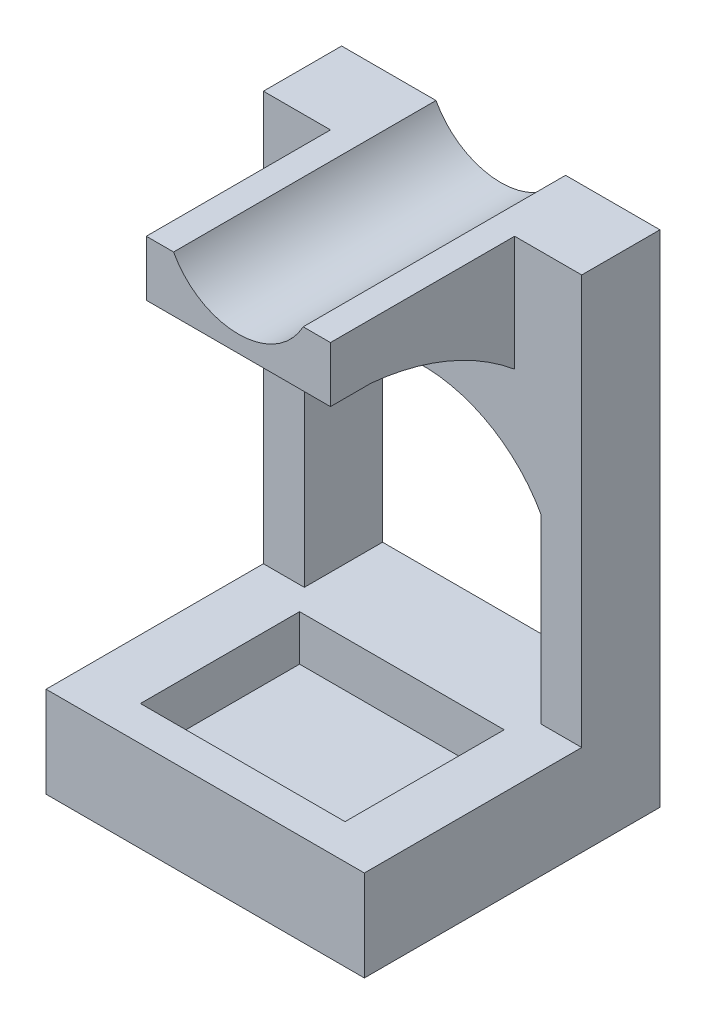
ISO-10303-21;
HEADER;
FILE_DESCRIPTION(('STEP AP214'),'2;1');
FILE_NAME('part.step','',(''),(''),'','','');
FILE_SCHEMA(('AUTOMOTIVE_DESIGN { 1 0 10303 214 1 1 1 1 }'));
ENDSEC;
DATA;
#1=APPLICATION_CONTEXT('core data for automotive mechanical design processes');
#2=APPLICATION_PROTOCOL_DEFINITION('international standard','automotive_design',2000,#1);
#3=PRODUCT_CONTEXT('',#1,'mechanical');
#4=PRODUCT('Part','Part','',(#3));
#5=PRODUCT_RELATED_PRODUCT_CATEGORY('part','',(#4));
#6=PRODUCT_DEFINITION_FORMATION('','',#4);
#7=PRODUCT_DEFINITION_CONTEXT('part definition',#1,'design');
#8=PRODUCT_DEFINITION('design','',#6,#7);
#9=PRODUCT_DEFINITION_SHAPE('','',#8);
#10=(LENGTH_UNIT() NAMED_UNIT(*) SI_UNIT(.MILLI.,.METRE.));
#11=(NAMED_UNIT(*) PLANE_ANGLE_UNIT() SI_UNIT($,.RADIAN.));
#12=(NAMED_UNIT(*) SI_UNIT($,.STERADIAN.) SOLID_ANGLE_UNIT());
#13=UNCERTAINTY_MEASURE_WITH_UNIT(LENGTH_MEASURE(1.E-05),#10,'distance_accuracy_value','');
#14=(GEOMETRIC_REPRESENTATION_CONTEXT(3) GLOBAL_UNCERTAINTY_ASSIGNED_CONTEXT((#13)) GLOBAL_UNIT_ASSIGNED_CONTEXT((#10,
#11,#12)) REPRESENTATION_CONTEXT('',''));
#15=CARTESIAN_POINT('',(0.,0.,0.));
#16=DIRECTION('',(0.,0.,1.));
#17=DIRECTION('',(1.,0.,0.));
#18=AXIS2_PLACEMENT_3D('',#15,#16,#17);
#19=CARTESIAN_POINT('',(0.,95.,-47.7945006776525));
#20=DIRECTION('',(0.,0.,-1.));
#21=DIRECTION('',(-1.,0.,0.));
#22=AXIS2_PLACEMENT_3D('',#19,#20,#21);
#23=PLANE('',#22);
#24=DIRECTION('',(0.,1.,0.));
#25=VECTOR('',#24,1.);
#26=CARTESIAN_POINT('',(55.25,110.,-47.7945006776525));
#27=LINE('',#26,#25);
#28=CARTESIAN_POINT('',(55.25,84.6757577504854,-47.7945006776525));
#29=VERTEX_POINT('',#28);
#30=CARTESIAN_POINT('',(55.25,110.,-47.7945006776525));
#31=VERTEX_POINT('',#30);
#32=EDGE_CURVE('E492',#29,#31,#27,.T.);
#33=ORIENTED_EDGE('',*,*,#32,.F.);
#34=DIRECTION('',(-1.,0.,0.));
#35=VECTOR('',#34,1.);
#36=CARTESIAN_POINT('',(55.25,84.6757577504854,-47.7945006776525));
#37=LINE('',#36,#35);
#38=CARTESIAN_POINT('',(14.75,84.6757577504854,-47.7945006776525));
#39=VERTEX_POINT('',#38);
#40=EDGE_CURVE('E219',#29,#39,#37,.T.);
#41=ORIENTED_EDGE('',*,*,#40,.T.);
#42=DIRECTION('',(0.,-1.,0.));
#43=VECTOR('',#42,1.);
#44=CARTESIAN_POINT('',(14.75,110.,-47.7945006776525));
#45=LINE('',#44,#43);
#46=CARTESIAN_POINT('',(14.75,110.,-47.7945006776525));
#47=VERTEX_POINT('',#46);
#48=EDGE_CURVE('E489',#47,#39,#45,.T.);
#49=ORIENTED_EDGE('',*,*,#48,.F.);
#50=DIRECTION('',(1.,0.,0.));
#51=VECTOR('',#50,1.);
#52=CARTESIAN_POINT('',(0.,110.,-47.7945006776525));
#53=LINE('',#52,#51);
#54=CARTESIAN_POINT('',(0.,110.,-47.7945006776525));
#55=VERTEX_POINT('',#54);
#56=EDGE_CURVE('E266',#55,#47,#53,.T.);
#57=ORIENTED_EDGE('',*,*,#56,.F.);
#58=DIRECTION('',(0.,-1.,0.));
#59=VECTOR('',#58,1.);
#60=CARTESIAN_POINT('',(0.,95.,-47.7945006776525));
#61=LINE('',#60,#59);
#62=CARTESIAN_POINT('',(0.,20.,-47.7945006776525));
#63=VERTEX_POINT('',#62);
#64=EDGE_CURVE('E370',#55,#63,#61,.T.);
#65=ORIENTED_EDGE('',*,*,#64,.T.);
#66=DIRECTION('',(1.,0.,0.));
#67=VECTOR('',#66,1.);
#68=CARTESIAN_POINT('',(0.,20.,-47.7945006776525));
#69=LINE('',#68,#67);
#70=CARTESIAN_POINT('',(8.99999999999998,20.,-47.7945006776525));
#71=VERTEX_POINT('',#70);
#72=EDGE_CURVE('E362',#63,#71,#69,.T.);
#73=ORIENTED_EDGE('',*,*,#72,.T.);
#74=DIRECTION('',(0.,-1.,0.));
#75=VECTOR('',#74,1.);
#76=CARTESIAN_POINT('',(8.99999999999999,60.,-47.7945006776525));
#77=LINE('',#76,#75);
#78=CARTESIAN_POINT('',(8.99999999999999,60.,-47.7945006776525));
#79=VERTEX_POINT('',#78);
#80=EDGE_CURVE('E323',#79,#71,#77,.T.);
#81=ORIENTED_EDGE('',*,*,#80,.F.);
#82=CARTESIAN_POINT('',(35.,45.5175775828065,-47.7945006776525));
#83=DIRECTION('',(0.,0.,-1.));
#84=DIRECTION('',(-1.,0.,0.));
#85=AXIS2_PLACEMENT_3D('',#82,#83,#84);
#86=CIRCLE('',#85,29.7613937689422);
#87=CARTESIAN_POINT('',(61.,60.,-47.7945006776525));
#88=VERTEX_POINT('',#87);
#89=EDGE_CURVE('E319',#88,#79,#86,.F.);
#90=ORIENTED_EDGE('',*,*,#89,.F.);
#91=DIRECTION('',(0.,1.,0.));
#92=VECTOR('',#91,1.);
#93=CARTESIAN_POINT('',(61.,60.,-47.7945006776525));
#94=LINE('',#93,#92);
#95=CARTESIAN_POINT('',(61.,20.,-47.7945006776525));
#96=VERTEX_POINT('',#95);
#97=EDGE_CURVE('E348',#96,#88,#94,.T.);
#98=ORIENTED_EDGE('',*,*,#97,.F.);
#99=CARTESIAN_POINT('',(70.,20.,-47.7945006776525));
#100=VERTEX_POINT('',#99);
#101=EDGE_CURVE('E361',#96,#100,#69,.T.);
#102=ORIENTED_EDGE('',*,*,#101,.T.);
#103=DIRECTION('',(0.,-1.,0.));
#104=VECTOR('',#103,1.);
#105=CARTESIAN_POINT('',(70.,95.,-47.7945006776525));
#106=LINE('',#105,#104);
#107=CARTESIAN_POINT('',(70.,110.,-47.7945006776525));
#108=VERTEX_POINT('',#107);
#109=EDGE_CURVE('E366',#108,#100,#106,.T.);
#110=ORIENTED_EDGE('',*,*,#109,.F.);
#111=EDGE_CURVE('E265',#31,#108,#53,.T.);
#112=ORIENTED_EDGE('',*,*,#111,.F.);
#113=EDGE_LOOP('',(#33,#41,#49,#57,#65,#73,#81,#90,#98,#102,#110,#112));
#114=FACE_BOUND('',#113,.T.);
#115=ADVANCED_FACE('F43',(#114),#23,.F.);
#116=CARTESIAN_POINT('',(0.,110.,0.));
#117=DIRECTION('',(0.,1.,0.));
#118=DIRECTION('',(0.,0.,1.));
#119=AXIS2_PLACEMENT_3D('',#116,#117,#118);
#120=PLANE('',#119);
#121=DIRECTION('',(-1.,0.,0.));
#122=VECTOR('',#121,1.);
#123=CARTESIAN_POINT('',(0.,110.,-65.));
#124=LINE('',#123,#122);
#125=CARTESIAN_POINT('',(70.,110.,-65.));
#126=VERTEX_POINT('',#125);
#127=CARTESIAN_POINT('',(49.25,110.,-65.));
#128=VERTEX_POINT('',#127);
#129=EDGE_CURVE('E275',#126,#128,#124,.T.);
#130=ORIENTED_EDGE('',*,*,#129,.T.);
#131=DIRECTION('',(0.,0.,1.));
#132=VECTOR('',#131,1.);
#133=CARTESIAN_POINT('',(49.25,110.,-268.616902707103));
#134=LINE('',#133,#132);
#135=CARTESIAN_POINT('',(49.25,110.,-7.29450067765245));
#136=VERTEX_POINT('',#135);
#137=EDGE_CURVE('E253',#128,#136,#134,.T.);
#138=ORIENTED_EDGE('',*,*,#137,.T.);
#139=DIRECTION('',(-1.,0.,0.));
#140=VECTOR('',#139,1.);
#141=CARTESIAN_POINT('',(49.25,110.,-7.29450067765245));
#142=LINE('',#141,#140);
#143=CARTESIAN_POINT('',(55.25,110.,-7.29450067765245));
#144=VERTEX_POINT('',#143);
#145=EDGE_CURVE('E247',#144,#136,#142,.T.);
#146=ORIENTED_EDGE('',*,*,#145,.F.);
#147=DIRECTION('',(0.,0.,-1.));
#148=VECTOR('',#147,1.);
#149=CARTESIAN_POINT('',(55.25,110.,-7.29450067765245));
#150=LINE('',#149,#148);
#151=EDGE_CURVE('E240',#144,#31,#150,.T.);
#152=ORIENTED_EDGE('',*,*,#151,.T.);
#153=ORIENTED_EDGE('',*,*,#111,.T.);
#154=DIRECTION('',(0.,0.,-1.));
#155=VECTOR('',#154,1.);
#156=CARTESIAN_POINT('',(70.,110.,-65.));
#157=LINE('',#156,#155);
#158=EDGE_CURVE('E270',#108,#126,#157,.T.);
#159=ORIENTED_EDGE('',*,*,#158,.T.);
#160=EDGE_LOOP('',(#130,#138,#146,#152,#153,#159));
#161=FACE_BOUND('',#160,.T.);
#162=ADVANCED_FACE('F476',(#161),#120,.T.);
#163=CARTESIAN_POINT('',(0.,20.,0.));
#164=DIRECTION('',(0.,-1.,0.));
#165=DIRECTION('',(0.,0.,-1.));
#166=AXIS2_PLACEMENT_3D('',#163,#164,#165);
#167=PLANE('',#166);
#168=DIRECTION('',(1.,0.,0.));
#169=VECTOR('',#168,1.);
#170=CARTESIAN_POINT('',(13.1,20.,-7.65036907516559));
#171=LINE('',#170,#169);
#172=CARTESIAN_POINT('',(13.1,20.,-7.65036907516559));
#173=VERTEX_POINT('',#172);
#174=CARTESIAN_POINT('',(58.1,20.,-7.65036907516559));
#175=VERTEX_POINT('',#174);
#176=EDGE_CURVE('E395',#173,#175,#171,.T.);
#177=ORIENTED_EDGE('',*,*,#176,.F.);
#178=DIRECTION('',(0.,0.,1.));
#179=VECTOR('',#178,1.);
#180=CARTESIAN_POINT('',(13.1,20.,-42.6503690751656));
#181=LINE('',#180,#179);
#182=CARTESIAN_POINT('',(13.1,20.,-42.6503690751656));
#183=VERTEX_POINT('',#182);
#184=EDGE_CURVE('E374',#183,#173,#181,.T.);
#185=ORIENTED_EDGE('',*,*,#184,.F.);
#186=DIRECTION('',(-1.,0.,0.));
#187=VECTOR('',#186,1.);
#188=CARTESIAN_POINT('',(13.1,20.,-42.6503690751656));
#189=LINE('',#188,#187);
#190=CARTESIAN_POINT('',(58.1,20.,-42.6503690751656));
#191=VERTEX_POINT('',#190);
#192=EDGE_CURVE('E380',#191,#183,#189,.T.);
#193=ORIENTED_EDGE('',*,*,#192,.F.);
#194=DIRECTION('',(0.,0.,-1.));
#195=VECTOR('',#194,1.);
#196=CARTESIAN_POINT('',(58.1,20.,-42.6503690751656));
#197=LINE('',#196,#195);
#198=EDGE_CURVE('E399',#175,#191,#197,.T.);
#199=ORIENTED_EDGE('',*,*,#198,.F.);
#200=EDGE_LOOP('',(#177,#185,#193,#199));
#201=FACE_BOUND('',#200,.T.);
#202=ORIENTED_EDGE('',*,*,#72,.F.);
#203=DIRECTION('',(0.,0.,1.));
#204=VECTOR('',#203,1.);
#205=CARTESIAN_POINT('',(0.,20.,0.));
#206=LINE('',#205,#204);
#207=CARTESIAN_POINT('',(0.,20.,0.));
#208=VERTEX_POINT('',#207);
#209=EDGE_CURVE('E419',#63,#208,#206,.T.);
#210=ORIENTED_EDGE('',*,*,#209,.T.);
#211=DIRECTION('',(1.,0.,0.));
#212=VECTOR('',#211,1.);
#213=CARTESIAN_POINT('',(0.,20.,0.));
#214=LINE('',#213,#212);
#215=CARTESIAN_POINT('',(70.,20.,0.));
#216=VERTEX_POINT('',#215);
#217=EDGE_CURVE('E422',#208,#216,#214,.T.);
#218=ORIENTED_EDGE('',*,*,#217,.T.);
#219=DIRECTION('',(0.,0.,-1.));
#220=VECTOR('',#219,1.);
#221=CARTESIAN_POINT('',(70.,20.,0.));
#222=LINE('',#221,#220);
#223=EDGE_CURVE('E426',#216,#100,#222,.T.);
#224=ORIENTED_EDGE('',*,*,#223,.T.);
#225=ORIENTED_EDGE('',*,*,#101,.F.);
#226=DIRECTION('',(0.,0.,-1.));
#227=VECTOR('',#226,1.);
#228=CARTESIAN_POINT('',(61.,20.,0.001000000000001));
#229=LINE('',#228,#227);
#230=CARTESIAN_POINT('',(61.,20.,-65.));
#231=VERTEX_POINT('',#230);
#232=EDGE_CURVE('E352',#96,#231,#229,.T.);
#233=ORIENTED_EDGE('',*,*,#232,.T.);
#234=DIRECTION('',(-1.,0.,0.));
#235=VECTOR('',#234,1.);
#236=CARTESIAN_POINT('',(61.,20.,-65.));
#237=LINE('',#236,#235);
#238=CARTESIAN_POINT('',(8.99999999999998,20.,-65.));
#239=VERTEX_POINT('',#238);
#240=EDGE_CURVE('E336',#231,#239,#237,.T.);
#241=ORIENTED_EDGE('',*,*,#240,.T.);
#242=DIRECTION('',(0.,0.,-1.));
#243=VECTOR('',#242,1.);
#244=CARTESIAN_POINT('',(8.99999999999998,20.,0.001000000000001));
#245=LINE('',#244,#243);
#246=EDGE_CURVE('E349',#71,#239,#245,.T.);
#247=ORIENTED_EDGE('',*,*,#246,.F.);
#248=EDGE_LOOP('',(#202,#210,#218,#224,#225,#233,#241,#247));
#249=FACE_BOUND('',#248,.T.);
#250=ADVANCED_FACE('F485',(#201,#249),#167,.F.);
#251=CARTESIAN_POINT('',(0.,20.,0.));
#252=DIRECTION('',(1.,0.,0.));
#253=DIRECTION('',(0.,0.,-1.));
#254=AXIS2_PLACEMENT_3D('',#251,#252,#253);
#255=PLANE('',#254);
#256=DIRECTION('',(0.,0.,1.));
#257=VECTOR('',#256,1.);
#258=CARTESIAN_POINT('',(0.,0.,0.));
#259=LINE('',#258,#257);
#260=CARTESIAN_POINT('',(0.,0.,-65.));
#261=VERTEX_POINT('',#260);
#262=CARTESIAN_POINT('',(0.,0.,0.));
#263=VERTEX_POINT('',#262);
#264=EDGE_CURVE('E409',#261,#263,#259,.T.);
#265=ORIENTED_EDGE('',*,*,#264,.T.);
#266=DIRECTION('',(0.,-1.,0.));
#267=VECTOR('',#266,1.);
#268=CARTESIAN_POINT('',(0.,20.,0.));
#269=LINE('',#268,#267);
#270=EDGE_CURVE('E11',#208,#263,#269,.T.);
#271=ORIENTED_EDGE('',*,*,#270,.F.);
#272=ORIENTED_EDGE('',*,*,#209,.F.);
#273=ORIENTED_EDGE('',*,*,#64,.F.);
#274=DIRECTION('',(0.,0.,1.));
#275=VECTOR('',#274,1.);
#276=CARTESIAN_POINT('',(0.,110.,-65.));
#277=LINE('',#276,#275);
#278=CARTESIAN_POINT('',(0.,110.,-65.));
#279=VERTEX_POINT('',#278);
#280=EDGE_CURVE('E261',#279,#55,#277,.T.);
#281=ORIENTED_EDGE('',*,*,#280,.F.);
#282=DIRECTION('',(0.,-1.,0.));
#283=VECTOR('',#282,1.);
#284=CARTESIAN_POINT('',(0.,20.,-65.));
#285=LINE('',#284,#283);
#286=EDGE_CURVE('E430',#279,#261,#285,.T.);
#287=ORIENTED_EDGE('',*,*,#286,.T.);
#288=EDGE_LOOP('',(#265,#271,#272,#273,#281,#287));
#289=FACE_BOUND('',#288,.T.);
#290=ADVANCED_FACE('F45',(#289),#255,.F.);
#291=CARTESIAN_POINT('',(0.,20.,0.));
#292=DIRECTION('',(0.,0.,-1.));
#293=DIRECTION('',(-1.,0.,0.));
#294=AXIS2_PLACEMENT_3D('',#291,#292,#293);
#295=PLANE('',#294);
#296=DIRECTION('',(1.,0.,0.));
#297=VECTOR('',#296,1.);
#298=CARTESIAN_POINT('',(0.,0.,0.));
#299=LINE('',#298,#297);
#300=CARTESIAN_POINT('',(70.,0.,0.));
#301=VERTEX_POINT('',#300);
#302=EDGE_CURVE('E434',#263,#301,#299,.T.);
#303=ORIENTED_EDGE('',*,*,#302,.T.);
#304=DIRECTION('',(0.,-1.,0.));
#305=VECTOR('',#304,1.);
#306=CARTESIAN_POINT('',(70.,20.,0.));
#307=LINE('',#306,#305);
#308=EDGE_CURVE('E52',#216,#301,#307,.T.);
#309=ORIENTED_EDGE('',*,*,#308,.F.);
#310=ORIENTED_EDGE('',*,*,#217,.F.);
#311=ORIENTED_EDGE('',*,*,#270,.T.);
#312=EDGE_LOOP('',(#303,#309,#310,#311));
#313=FACE_BOUND('',#312,.T.);
#314=ADVANCED_FACE('F486',(#313),#295,.F.);
#315=CARTESIAN_POINT('',(70.,20.,0.));
#316=DIRECTION('',(-1.,0.,0.));
#317=DIRECTION('',(0.,0.,1.));
#318=AXIS2_PLACEMENT_3D('',#315,#316,#317);
#319=PLANE('',#318);
#320=DIRECTION('',(0.,0.,-1.));
#321=VECTOR('',#320,1.);
#322=CARTESIAN_POINT('',(70.,0.,0.));
#323=LINE('',#322,#321);
#324=CARTESIAN_POINT('',(70.,0.,-65.));
#325=VERTEX_POINT('',#324);
#326=EDGE_CURVE('E437',#301,#325,#323,.T.);
#327=ORIENTED_EDGE('',*,*,#326,.T.);
#328=DIRECTION('',(0.,-1.,0.));
#329=VECTOR('',#328,1.);
#330=CARTESIAN_POINT('',(70.,20.,-65.));
#331=LINE('',#330,#329);
#332=EDGE_CURVE('E445',#126,#325,#331,.T.);
#333=ORIENTED_EDGE('',*,*,#332,.F.);
#334=ORIENTED_EDGE('',*,*,#158,.F.);
#335=ORIENTED_EDGE('',*,*,#109,.T.);
#336=ORIENTED_EDGE('',*,*,#223,.F.);
#337=ORIENTED_EDGE('',*,*,#308,.T.);
#338=EDGE_LOOP('',(#327,#333,#334,#335,#336,#337));
#339=FACE_BOUND('',#338,.T.);
#340=ADVANCED_FACE('F454',(#339),#319,.F.);
#341=CARTESIAN_POINT('',(0.,20.,-65.));
#342=DIRECTION('',(0.,0.,1.));
#343=DIRECTION('',(1.,0.,0.));
#344=AXIS2_PLACEMENT_3D('',#341,#342,#343);
#345=PLANE('',#344);
#346=CARTESIAN_POINT('',(35.,117.654016334487,-65.));
#347=DIRECTION('',(0.,0.,1.));
#348=DIRECTION('',(1.,0.,0.));
#349=AXIS2_PLACEMENT_3D('',#346,#347,#348);
#350=CIRCLE('',#349,16.1754896695154);
#351=CARTESIAN_POINT('',(20.75,110.,-65.));
#352=VERTEX_POINT('',#351);
#353=EDGE_CURVE('E66',#128,#352,#350,.F.);
#354=ORIENTED_EDGE('',*,*,#353,.F.);
#355=ORIENTED_EDGE('',*,*,#129,.F.);
#356=ORIENTED_EDGE('',*,*,#332,.T.);
#357=DIRECTION('',(-1.,0.,0.));
#358=VECTOR('',#357,1.);
#359=CARTESIAN_POINT('',(0.,0.,-65.));
#360=LINE('',#359,#358);
#361=EDGE_CURVE('E423',#325,#261,#360,.T.);
#362=ORIENTED_EDGE('',*,*,#361,.T.);
#363=ORIENTED_EDGE('',*,*,#286,.F.);
#364=EDGE_CURVE('E274',#352,#279,#124,.T.);
#365=ORIENTED_EDGE('',*,*,#364,.F.);
#366=EDGE_LOOP('',(#354,#355,#356,#362,#363,#365));
#367=FACE_BOUND('',#366,.T.);
#368=CARTESIAN_POINT('',(35.,45.5175775828065,-65.));
#369=DIRECTION('',(0.,0.,-1.));
#370=DIRECTION('',(1.,0.,0.));
#371=AXIS2_PLACEMENT_3D('',#368,#369,#370);
#372=CIRCLE('',#371,29.7613937689422);
#373=CARTESIAN_POINT('',(49.25,71.6456861838903,-64.9999999999989));
#374=VERTEX_POINT('',#373);
#375=CARTESIAN_POINT('',(61.,60.,-65.));
#376=VERTEX_POINT('',#375);
#377=EDGE_CURVE('E327',#374,#376,#372,.T.);
#378=ORIENTED_EDGE('',*,*,#377,.F.);
#379=DIRECTION('',(0.,1.,0.));
#380=VECTOR('',#379,1.);
#381=CARTESIAN_POINT('',(49.25,-0.001000000000001,-64.9999999999989));
#382=LINE('',#381,#380);
#383=CARTESIAN_POINT('',(49.25,95.,-65.));
#384=VERTEX_POINT('',#383);
#385=EDGE_CURVE('E306',#374,#384,#382,.T.);
#386=ORIENTED_EDGE('',*,*,#385,.T.);
#387=DIRECTION('',(-1.,0.,0.));
#388=VECTOR('',#387,1.);
#389=CARTESIAN_POINT('',(0.,95.,-65.));
#390=LINE('',#389,#388);
#391=CARTESIAN_POINT('',(20.75,95.,-65.));
#392=VERTEX_POINT('',#391);
#393=EDGE_CURVE('E260',#384,#392,#390,.T.);
#394=ORIENTED_EDGE('',*,*,#393,.T.);
#395=DIRECTION('',(0.,1.,0.));
#396=VECTOR('',#395,1.);
#397=CARTESIAN_POINT('',(20.75,-0.001000000000001,-64.9999999999989));
#398=LINE('',#397,#396);
#399=CARTESIAN_POINT('',(20.75,71.6456861838903,-64.9999999999989));
#400=VERTEX_POINT('',#399);
#401=EDGE_CURVE('E301',#400,#392,#398,.T.);
#402=ORIENTED_EDGE('',*,*,#401,.F.);
#403=CARTESIAN_POINT('',(8.99999999999999,60.,-65.));
#404=VERTEX_POINT('',#403);
#405=EDGE_CURVE('E328',#404,#400,#372,.T.);
#406=ORIENTED_EDGE('',*,*,#405,.F.);
#407=DIRECTION('',(0.,1.,0.));
#408=VECTOR('',#407,1.);
#409=CARTESIAN_POINT('',(8.99999999999999,60.,-65.));
#410=LINE('',#409,#408);
#411=EDGE_CURVE('E340',#239,#404,#410,.T.);
#412=ORIENTED_EDGE('',*,*,#411,.F.);
#413=ORIENTED_EDGE('',*,*,#240,.F.);
#414=DIRECTION('',(0.,-1.,0.));
#415=VECTOR('',#414,1.);
#416=CARTESIAN_POINT('',(61.,60.,-65.));
#417=LINE('',#416,#415);
#418=EDGE_CURVE('E332',#376,#231,#417,.T.);
#419=ORIENTED_EDGE('',*,*,#418,.F.);
#420=EDGE_LOOP('',(#378,#386,#394,#402,#406,#412,#413,#419));
#421=FACE_BOUND('',#420,.T.);
#422=ADVANCED_FACE('F462',(#367,#421),#345,.F.);
#423=CARTESIAN_POINT('',(0.,0.,0.));
#424=DIRECTION('',(0.,-1.,0.));
#425=DIRECTION('',(0.,0.,-1.));
#426=AXIS2_PLACEMENT_3D('',#423,#424,#425);
#427=PLANE('',#426);
#428=ORIENTED_EDGE('',*,*,#264,.F.);
#429=ORIENTED_EDGE('',*,*,#361,.F.);
#430=ORIENTED_EDGE('',*,*,#326,.F.);
#431=ORIENTED_EDGE('',*,*,#302,.F.);
#432=EDGE_LOOP('',(#428,#429,#430,#431));
#433=FACE_BOUND('',#432,.T.);
#434=ADVANCED_FACE('F460',(#433),#427,.T.);
#435=CARTESIAN_POINT('',(13.1,10.,-42.6503690751656));
#436=DIRECTION('',(-1.,0.,0.));
#437=DIRECTION('',(0.,0.,1.));
#438=AXIS2_PLACEMENT_3D('',#435,#436,#437);
#439=PLANE('',#438);
#440=ORIENTED_EDGE('',*,*,#184,.T.);
#441=DIRECTION('',(0.,1.,0.));
#442=VECTOR('',#441,1.);
#443=CARTESIAN_POINT('',(13.1,10.,-7.65036907516559));
#444=LINE('',#443,#442);
#445=CARTESIAN_POINT('',(13.1,10.,-7.65036907516559));
#446=VERTEX_POINT('',#445);
#447=EDGE_CURVE('E392',#446,#173,#444,.T.);
#448=ORIENTED_EDGE('',*,*,#447,.F.);
#449=DIRECTION('',(0.,0.,1.));
#450=VECTOR('',#449,1.);
#451=CARTESIAN_POINT('',(13.1,10.,-42.6503690751656));
#452=LINE('',#451,#450);
#453=CARTESIAN_POINT('',(13.1,10.,-42.6503690751656));
#454=VERTEX_POINT('',#453);
#455=EDGE_CURVE('E375',#454,#446,#452,.T.);
#456=ORIENTED_EDGE('',*,*,#455,.F.);
#457=DIRECTION('',(0.,1.,0.));
#458=VECTOR('',#457,1.);
#459=CARTESIAN_POINT('',(13.1,10.,-42.6503690751656));
#460=LINE('',#459,#458);
#461=EDGE_CURVE('E406',#454,#183,#460,.T.);
#462=ORIENTED_EDGE('',*,*,#461,.T.);
#463=EDGE_LOOP('',(#440,#448,#456,#462));
#464=FACE_BOUND('',#463,.T.);
#465=ADVANCED_FACE('F554',(#464),#439,.F.);
#466=CARTESIAN_POINT('',(13.1,10.,-42.6503690751656));
#467=DIRECTION('',(0.,0.,-1.));
#468=DIRECTION('',(-1.,0.,0.));
#469=AXIS2_PLACEMENT_3D('',#466,#467,#468);
#470=PLANE('',#469);
#471=ORIENTED_EDGE('',*,*,#192,.T.);
#472=ORIENTED_EDGE('',*,*,#461,.F.);
#473=DIRECTION('',(-1.,0.,0.));
#474=VECTOR('',#473,1.);
#475=CARTESIAN_POINT('',(13.1,10.,-42.6503690751656));
#476=LINE('',#475,#474);
#477=CARTESIAN_POINT('',(58.1,10.,-42.6503690751656));
#478=VERTEX_POINT('',#477);
#479=EDGE_CURVE('E388',#478,#454,#476,.T.);
#480=ORIENTED_EDGE('',*,*,#479,.F.);
#481=DIRECTION('',(0.,1.,0.));
#482=VECTOR('',#481,1.);
#483=CARTESIAN_POINT('',(58.1,10.,-42.6503690751656));
#484=LINE('',#483,#482);
#485=EDGE_CURVE('E410',#478,#191,#484,.T.);
#486=ORIENTED_EDGE('',*,*,#485,.T.);
#487=EDGE_LOOP('',(#471,#472,#480,#486));
#488=FACE_BOUND('',#487,.T.);
#489=ADVANCED_FACE('F550',(#488),#470,.F.);
#490=CARTESIAN_POINT('',(58.1,10.,-42.6503690751656));
#491=DIRECTION('',(1.,0.,0.));
#492=DIRECTION('',(0.,0.,-1.));
#493=AXIS2_PLACEMENT_3D('',#490,#491,#492);
#494=PLANE('',#493);
#495=ORIENTED_EDGE('',*,*,#198,.T.);
#496=ORIENTED_EDGE('',*,*,#485,.F.);
#497=DIRECTION('',(0.,0.,-1.));
#498=VECTOR('',#497,1.);
#499=CARTESIAN_POINT('',(58.1,10.,-42.6503690751656));
#500=LINE('',#499,#498);
#501=CARTESIAN_POINT('',(58.1,10.,-7.65036907516559));
#502=VERTEX_POINT('',#501);
#503=EDGE_CURVE('E384',#502,#478,#500,.T.);
#504=ORIENTED_EDGE('',*,*,#503,.F.);
#505=DIRECTION('',(0.,1.,0.));
#506=VECTOR('',#505,1.);
#507=CARTESIAN_POINT('',(58.1,10.,-7.65036907516559));
#508=LINE('',#507,#506);
#509=EDGE_CURVE('E413',#502,#175,#508,.T.);
#510=ORIENTED_EDGE('',*,*,#509,.T.);
#511=EDGE_LOOP('',(#495,#496,#504,#510));
#512=FACE_BOUND('',#511,.T.);
#513=ADVANCED_FACE('F553',(#512),#494,.F.);
#514=CARTESIAN_POINT('',(13.1,10.,-7.65036907516559));
#515=DIRECTION('',(0.,0.,1.));
#516=DIRECTION('',(1.,0.,0.));
#517=AXIS2_PLACEMENT_3D('',#514,#515,#516);
#518=PLANE('',#517);
#519=ORIENTED_EDGE('',*,*,#176,.T.);
#520=ORIENTED_EDGE('',*,*,#509,.F.);
#521=DIRECTION('',(1.,0.,0.));
#522=VECTOR('',#521,1.);
#523=CARTESIAN_POINT('',(13.1,10.,-7.65036907516559));
#524=LINE('',#523,#522);
#525=EDGE_CURVE('E379',#446,#502,#524,.T.);
#526=ORIENTED_EDGE('',*,*,#525,.F.);
#527=ORIENTED_EDGE('',*,*,#447,.T.);
#528=EDGE_LOOP('',(#519,#520,#526,#527));
#529=FACE_BOUND('',#528,.T.);
#530=ADVANCED_FACE('F548',(#529),#518,.F.);
#531=CARTESIAN_POINT('',(0.,10.,0.));
#532=DIRECTION('',(0.,1.,0.));
#533=DIRECTION('',(0.,0.,1.));
#534=AXIS2_PLACEMENT_3D('',#531,#532,#533);
#535=PLANE('',#534);
#536=ORIENTED_EDGE('',*,*,#455,.T.);
#537=ORIENTED_EDGE('',*,*,#525,.T.);
#538=ORIENTED_EDGE('',*,*,#503,.T.);
#539=ORIENTED_EDGE('',*,*,#479,.T.);
#540=EDGE_LOOP('',(#536,#537,#538,#539));
#541=FACE_BOUND('',#540,.T.);
#542=ADVANCED_FACE('F545',(#541),#535,.T.);
#543=CARTESIAN_POINT('',(35.,45.5175775828065,0.001000000000001));
#544=DIRECTION('',(0.,0.,-1.));
#545=DIRECTION('',(-1.,0.,0.));
#546=AXIS2_PLACEMENT_3D('',#543,#544,#545);
#547=CYLINDRICAL_SURFACE('',#546,29.7613937689422);
#548=CARTESIAN_POINT('',(35.,45.5175775828065,-58.6975110617232));
#549=DIRECTION('',(0.,0.,1.));
#550=DIRECTION('',(1.,0.,0.));
#551=AXIS2_PLACEMENT_3D('',#548,#549,#550);
#552=CIRCLE('',#551,29.7613937689422);
#553=CARTESIAN_POINT('',(49.25,71.6456861838903,-58.6975110617232));
#554=VERTEX_POINT('',#553);
#555=CARTESIAN_POINT('',(20.75,71.6456861838903,-58.6975110617232));
#556=VERTEX_POINT('',#555);
#557=EDGE_CURVE('E305',#554,#556,#552,.T.);
#558=ORIENTED_EDGE('',*,*,#557,.F.);
#559=DIRECTION('',(0.,0.,-1.));
#560=VECTOR('',#559,1.);
#561=CARTESIAN_POINT('',(49.25,71.6456861838903,0.001000000000001));
#562=LINE('',#561,#560);
#563=EDGE_CURVE('E278',#374,#554,#562,.F.);
#564=ORIENTED_EDGE('',*,*,#563,.F.);
#565=ORIENTED_EDGE('',*,*,#377,.T.);
#566=DIRECTION('',(0.,0.,-1.));
#567=VECTOR('',#566,1.);
#568=CARTESIAN_POINT('',(61.,60.,0.001000000000001));
#569=LINE('',#568,#567);
#570=EDGE_CURVE('E344',#88,#376,#569,.T.);
#571=ORIENTED_EDGE('',*,*,#570,.F.);
#572=ORIENTED_EDGE('',*,*,#89,.T.);
#573=DIRECTION('',(0.,0.,-1.));
#574=VECTOR('',#573,1.);
#575=CARTESIAN_POINT('',(8.99999999999999,60.,0.001000000000001));
#576=LINE('',#575,#574);
#577=EDGE_CURVE('E345',#79,#404,#576,.T.);
#578=ORIENTED_EDGE('',*,*,#577,.T.);
#579=ORIENTED_EDGE('',*,*,#405,.T.);
#580=DIRECTION('',(0.,0.,-1.));
#581=VECTOR('',#580,1.);
#582=CARTESIAN_POINT('',(20.75,71.6456861838903,0.001000000000001));
#583=LINE('',#582,#581);
#584=EDGE_CURVE('E285',#556,#400,#583,.T.);
#585=ORIENTED_EDGE('',*,*,#584,.F.);
#586=EDGE_LOOP('',(#558,#564,#565,#571,#572,#578,#579,#585));
#587=FACE_BOUND('',#586,.T.);
#588=ADVANCED_FACE('F543',(#587),#547,.F.);
#589=CARTESIAN_POINT('',(8.99999999999999,60.,0.001000000000001));
#590=DIRECTION('',(-1.,0.,0.));
#591=DIRECTION('',(0.,-1.,0.));
#592=AXIS2_PLACEMENT_3D('',#589,#590,#591);
#593=PLANE('',#592);
#594=ORIENTED_EDGE('',*,*,#80,.T.);
#595=ORIENTED_EDGE('',*,*,#246,.T.);
#596=ORIENTED_EDGE('',*,*,#411,.T.);
#597=ORIENTED_EDGE('',*,*,#577,.F.);
#598=EDGE_LOOP('',(#594,#595,#596,#597));
#599=FACE_BOUND('',#598,.T.);
#600=ADVANCED_FACE('F732',(#599),#593,.F.);
#601=CARTESIAN_POINT('',(61.,60.,0.001000000000001));
#602=DIRECTION('',(1.,0.,0.));
#603=DIRECTION('',(0.,1.,0.));
#604=AXIS2_PLACEMENT_3D('',#601,#602,#603);
#605=PLANE('',#604);
#606=ORIENTED_EDGE('',*,*,#97,.T.);
#607=ORIENTED_EDGE('',*,*,#570,.T.);
#608=ORIENTED_EDGE('',*,*,#418,.T.);
#609=ORIENTED_EDGE('',*,*,#232,.F.);
#610=EDGE_LOOP('',(#606,#607,#608,#609));
#611=FACE_BOUND('',#610,.T.);
#612=ADVANCED_FACE('F722',(#611),#605,.F.);
#613=CARTESIAN_POINT('',(20.75,-0.001000000000001,-58.6975110617232));
#614=DIRECTION('',(0.,0.,1.));
#615=DIRECTION('',(1.,0.,0.));
#616=AXIS2_PLACEMENT_3D('',#613,#614,#615);
#617=PLANE('',#616);
#618=ORIENTED_EDGE('',*,*,#557,.T.);
#619=DIRECTION('',(0.,1.,0.));
#620=VECTOR('',#619,1.);
#621=CARTESIAN_POINT('',(20.75,-0.001000000000001,-58.6975110617232));
#622=LINE('',#621,#620);
#623=CARTESIAN_POINT('',(20.75,95.,-58.6975110617232));
#624=VERTEX_POINT('',#623);
#625=EDGE_CURVE('E300',#556,#624,#622,.T.);
#626=ORIENTED_EDGE('',*,*,#625,.T.);
#627=DIRECTION('',(1.,0.,0.));
#628=VECTOR('',#627,1.);
#629=CARTESIAN_POINT('',(20.75,95.,-58.6975110617232));
#630=LINE('',#629,#628);
#631=CARTESIAN_POINT('',(49.25,95.,-58.6975110617232));
#632=VERTEX_POINT('',#631);
#633=EDGE_CURVE('E292',#624,#632,#630,.T.);
#634=ORIENTED_EDGE('',*,*,#633,.T.);
#635=DIRECTION('',(0.,1.,0.));
#636=VECTOR('',#635,1.);
#637=CARTESIAN_POINT('',(49.25,-0.001000000000001,-58.6975110617232));
#638=LINE('',#637,#636);
#639=EDGE_CURVE('E310',#554,#632,#638,.T.);
#640=ORIENTED_EDGE('',*,*,#639,.F.);
#641=EDGE_LOOP('',(#618,#626,#634,#640));
#642=FACE_BOUND('',#641,.T.);
#643=ADVANCED_FACE('F712',(#642),#617,.F.);
#644=CARTESIAN_POINT('',(49.25,-0.001000000000001,-64.9999999999989));
#645=DIRECTION('',(1.,0.,0.));
#646=DIRECTION('',(0.,0.,-1.));
#647=AXIS2_PLACEMENT_3D('',#644,#645,#646);
#648=PLANE('',#647);
#649=ORIENTED_EDGE('',*,*,#563,.T.);
#650=ORIENTED_EDGE('',*,*,#639,.T.);
#651=DIRECTION('',(0.,0.,-1.));
#652=VECTOR('',#651,1.);
#653=CARTESIAN_POINT('',(49.25,95.,-64.9999999999989));
#654=LINE('',#653,#652);
#655=EDGE_CURVE('E296',#632,#384,#654,.T.);
#656=ORIENTED_EDGE('',*,*,#655,.T.);
#657=ORIENTED_EDGE('',*,*,#385,.F.);
#658=EDGE_LOOP('',(#649,#650,#656,#657));
#659=FACE_BOUND('',#658,.T.);
#660=ADVANCED_FACE('F702',(#659),#648,.F.);
#661=CARTESIAN_POINT('',(20.75,-0.001000000000001,-64.9999999999989));
#662=DIRECTION('',(-1.,0.,0.));
#663=DIRECTION('',(0.,0.,1.));
#664=AXIS2_PLACEMENT_3D('',#661,#662,#663);
#665=PLANE('',#664);
#666=ORIENTED_EDGE('',*,*,#584,.T.);
#667=ORIENTED_EDGE('',*,*,#401,.T.);
#668=DIRECTION('',(0.,0.,1.));
#669=VECTOR('',#668,1.);
#670=CARTESIAN_POINT('',(20.75,95.,-64.9999999999989));
#671=LINE('',#670,#669);
#672=EDGE_CURVE('E288',#392,#624,#671,.T.);
#673=ORIENTED_EDGE('',*,*,#672,.T.);
#674=ORIENTED_EDGE('',*,*,#625,.F.);
#675=EDGE_LOOP('',(#666,#667,#673,#674));
#676=FACE_BOUND('',#675,.T.);
#677=ADVANCED_FACE('F605',(#676),#665,.F.);
#678=DIRECTION('',(0.,0.,1.));
#679=VECTOR('',#678,1.);
#680=CARTESIAN_POINT('',(20.75,110.,-268.616902707103));
#681=LINE('',#680,#679);
#682=CARTESIAN_POINT('',(20.75,110.,-7.29450067765245));
#683=VERTEX_POINT('',#682);
#684=EDGE_CURVE('E59',#352,#683,#681,.T.);
#685=ORIENTED_EDGE('',*,*,#684,.F.);
#686=ORIENTED_EDGE('',*,*,#364,.T.);
#687=ORIENTED_EDGE('',*,*,#280,.T.);
#688=ORIENTED_EDGE('',*,*,#56,.T.);
#689=DIRECTION('',(0.,0.,-1.));
#690=VECTOR('',#689,1.);
#691=CARTESIAN_POINT('',(14.75,110.,-7.29450067765245));
#692=LINE('',#691,#690);
#693=CARTESIAN_POINT('',(14.75,110.,-7.29450067765245));
#694=VERTEX_POINT('',#693);
#695=EDGE_CURVE('E244',#694,#47,#692,.T.);
#696=ORIENTED_EDGE('',*,*,#695,.F.);
#697=DIRECTION('',(-1.,0.,0.));
#698=VECTOR('',#697,1.);
#699=CARTESIAN_POINT('',(20.75,110.,-7.29450067765245));
#700=LINE('',#699,#698);
#701=EDGE_CURVE('E510',#683,#694,#700,.T.);
#702=ORIENTED_EDGE('',*,*,#701,.F.);
#703=EDGE_LOOP('',(#685,#686,#687,#688,#696,#702));
#704=FACE_BOUND('',#703,.T.);
#705=ADVANCED_FACE('F469',(#704),#120,.T.);
#706=CARTESIAN_POINT('',(0.,95.,0.));
#707=DIRECTION('',(0.,1.,0.));
#708=DIRECTION('',(0.,0.,1.));
#709=AXIS2_PLACEMENT_3D('',#706,#707,#708);
#710=PLANE('',#709);
#711=ORIENTED_EDGE('',*,*,#655,.F.);
#712=ORIENTED_EDGE('',*,*,#633,.F.);
#713=ORIENTED_EDGE('',*,*,#672,.F.);
#714=ORIENTED_EDGE('',*,*,#393,.F.);
#715=EDGE_LOOP('',(#711,#712,#713,#714));
#716=FACE_BOUND('',#715,.T.);
#717=ADVANCED_FACE('F526',(#716),#710,.F.);
#718=CARTESIAN_POINT('',(35.,117.654016334487,-268.616902707103));
#719=DIRECTION('',(0.,0.,1.));
#720=DIRECTION('',(1.,0.,0.));
#721=AXIS2_PLACEMENT_3D('',#718,#719,#720);
#722=CYLINDRICAL_SURFACE('',#721,16.1754896695154);
#723=ORIENTED_EDGE('',*,*,#137,.F.);
#724=ORIENTED_EDGE('',*,*,#353,.T.);
#725=ORIENTED_EDGE('',*,*,#684,.T.);
#726=CARTESIAN_POINT('',(35.,117.654016334487,-7.29450067765245));
#727=DIRECTION('',(0.,0.,-1.));
#728=DIRECTION('',(1.,0.,0.));
#729=AXIS2_PLACEMENT_3D('',#726,#727,#728);
#730=CIRCLE('',#729,16.1754896695154);
#731=EDGE_CURVE('E496',#136,#683,#730,.T.);
#732=ORIENTED_EDGE('',*,*,#731,.F.);
#733=EDGE_LOOP('',(#723,#724,#725,#732));
#734=FACE_BOUND('',#733,.T.);
#735=ADVANCED_FACE('F524',(#734),#722,.F.);
#736=CARTESIAN_POINT('',(14.75,110.,-7.29450067765245));
#737=DIRECTION('',(1.,0.,0.));
#738=DIRECTION('',(0.,1.,0.));
#739=AXIS2_PLACEMENT_3D('',#736,#737,#738);
#740=PLANE('',#739);
#741=ORIENTED_EDGE('',*,*,#48,.T.);
#742=CARTESIAN_POINT('',(14.75,39.9110556892534,-10.6627401417663));
#743=DIRECTION('',(1.,0.,0.));
#744=DIRECTION('',(0.,-1.,0.));
#745=AXIS2_PLACEMENT_3D('',#742,#743,#744);
#746=CIRCLE('',#745,58.1605208979877);
#747=CARTESIAN_POINT('',(14.75,97.797353366875,-16.3039042328958));
#748=VERTEX_POINT('',#747);
#749=EDGE_CURVE('E223',#39,#748,#746,.T.);
#750=ORIENTED_EDGE('',*,*,#749,.T.);
#751=DIRECTION('',(0.,0.,-1.));
#752=VECTOR('',#751,1.);
#753=CARTESIAN_POINT('',(14.75,97.797353366875,-7.29450067765245));
#754=LINE('',#753,#752);
#755=CARTESIAN_POINT('',(14.75,97.797353366875,-7.29450067765245));
#756=VERTEX_POINT('',#755);
#757=EDGE_CURVE('E233',#756,#748,#754,.T.);
#758=ORIENTED_EDGE('',*,*,#757,.F.);
#759=DIRECTION('',(0.,-1.,0.));
#760=VECTOR('',#759,1.);
#761=CARTESIAN_POINT('',(14.75,110.,-7.29450067765245));
#762=LINE('',#761,#760);
#763=EDGE_CURVE('E507',#694,#756,#762,.T.);
#764=ORIENTED_EDGE('',*,*,#763,.F.);
#765=ORIENTED_EDGE('',*,*,#695,.T.);
#766=EDGE_LOOP('',(#741,#750,#758,#764,#765));
#767=FACE_BOUND('',#766,.T.);
#768=ADVANCED_FACE('F517',(#767),#740,.F.);
#769=CARTESIAN_POINT('',(55.25,97.797353366875,-7.29450067765245));
#770=DIRECTION('',(0.,1.,0.));
#771=DIRECTION('',(0.,0.,1.));
#772=AXIS2_PLACEMENT_3D('',#769,#770,#771);
#773=PLANE('',#772);
#774=ORIENTED_EDGE('',*,*,#757,.T.);
#775=DIRECTION('',(-1.,0.,0.));
#776=VECTOR('',#775,1.);
#777=CARTESIAN_POINT('',(55.25,97.797353366875,-16.3039042328958));
#778=LINE('',#777,#776);
#779=CARTESIAN_POINT('',(55.25,97.797353366875,-16.3039042328958));
#780=VERTEX_POINT('',#779);
#781=EDGE_CURVE('E216',#780,#748,#778,.T.);
#782=ORIENTED_EDGE('',*,*,#781,.F.);
#783=DIRECTION('',(0.,0.,-1.));
#784=VECTOR('',#783,1.);
#785=CARTESIAN_POINT('',(55.25,97.797353366875,-7.29450067765245));
#786=LINE('',#785,#784);
#787=CARTESIAN_POINT('',(55.25,97.797353366875,-7.29450067765245));
#788=VERTEX_POINT('',#787);
#789=EDGE_CURVE('E230',#788,#780,#786,.T.);
#790=ORIENTED_EDGE('',*,*,#789,.F.);
#791=DIRECTION('',(1.,0.,0.));
#792=VECTOR('',#791,1.);
#793=CARTESIAN_POINT('',(14.75,97.797353366875,-7.29450067765245));
#794=LINE('',#793,#792);
#795=EDGE_CURVE('E504',#756,#788,#794,.T.);
#796=ORIENTED_EDGE('',*,*,#795,.F.);
#797=EDGE_LOOP('',(#774,#782,#790,#796));
#798=FACE_BOUND('',#797,.T.);
#799=ADVANCED_FACE('F228',(#798),#773,.F.);
#800=CARTESIAN_POINT('',(55.25,110.,-7.29450067765245));
#801=DIRECTION('',(-1.,0.,0.));
#802=DIRECTION('',(0.,0.,1.));
#803=AXIS2_PLACEMENT_3D('',#800,#801,#802);
#804=PLANE('',#803);
#805=ORIENTED_EDGE('',*,*,#32,.T.);
#806=ORIENTED_EDGE('',*,*,#151,.F.);
#807=DIRECTION('',(0.,1.,0.));
#808=VECTOR('',#807,1.);
#809=CARTESIAN_POINT('',(55.25,110.,-7.29450067765245));
#810=LINE('',#809,#808);
#811=EDGE_CURVE('E238',#788,#144,#810,.T.);
#812=ORIENTED_EDGE('',*,*,#811,.F.);
#813=ORIENTED_EDGE('',*,*,#789,.T.);
#814=CARTESIAN_POINT('',(55.25,39.9110556892534,-10.6627401417663));
#815=DIRECTION('',(1.,0.,0.));
#816=DIRECTION('',(0.,-1.,0.));
#817=AXIS2_PLACEMENT_3D('',#814,#815,#816);
#818=CIRCLE('',#817,58.1605208979877);
#819=EDGE_CURVE('E212',#29,#780,#818,.T.);
#820=ORIENTED_EDGE('',*,*,#819,.F.);
#821=EDGE_LOOP('',(#805,#806,#812,#813,#820));
#822=FACE_BOUND('',#821,.T.);
#823=ADVANCED_FACE('F236',(#822),#804,.F.);
#824=CARTESIAN_POINT('',(35.,117.654016334487,-7.29450067765245));
#825=DIRECTION('',(0.,0.,1.));
#826=DIRECTION('',(1.,0.,0.));
#827=AXIS2_PLACEMENT_3D('',#824,#825,#826);
#828=PLANE('',#827);
#829=ORIENTED_EDGE('',*,*,#731,.T.);
#830=ORIENTED_EDGE('',*,*,#701,.T.);
#831=ORIENTED_EDGE('',*,*,#763,.T.);
#832=ORIENTED_EDGE('',*,*,#795,.T.);
#833=ORIENTED_EDGE('',*,*,#811,.T.);
#834=ORIENTED_EDGE('',*,*,#145,.T.);
#835=EDGE_LOOP('',(#829,#830,#831,#832,#833,#834));
#836=FACE_BOUND('',#835,.T.);
#837=ADVANCED_FACE('F520',(#836),#828,.T.);
#838=CARTESIAN_POINT('',(55.25,39.9110556892534,-10.6627401417663));
#839=DIRECTION('',(-1.,0.,0.));
#840=DIRECTION('',(0.,-1.,0.));
#841=AXIS2_PLACEMENT_3D('',#838,#839,#840);
#842=CYLINDRICAL_SURFACE('',#841,58.1605208979877);
#843=ORIENTED_EDGE('',*,*,#749,.F.);
#844=ORIENTED_EDGE('',*,*,#40,.F.);
#845=ORIENTED_EDGE('',*,*,#819,.T.);
#846=ORIENTED_EDGE('',*,*,#781,.T.);
#847=EDGE_LOOP('',(#843,#844,#845,#846));
#848=FACE_BOUND('',#847,.T.);
#849=ADVANCED_FACE('F215',(#848),#842,.F.);
#850=CLOSED_SHELL('',(#115,#162,#250,#290,#314,#340,#422,#434,#465,#489,#513,#530,#542,#588,
#600,#612,#643,#660,#677,#705,#717,#735,#768,#799,#823,#837,#849));
#851=MANIFOLD_SOLID_BREP('B2',#850);
#852=ADVANCED_BREP_SHAPE_REPRESENTATION('',(#18,#851),#14);
#853=SHAPE_DEFINITION_REPRESENTATION(#9,#852);
ENDSEC;
END-ISO-10303-21;
